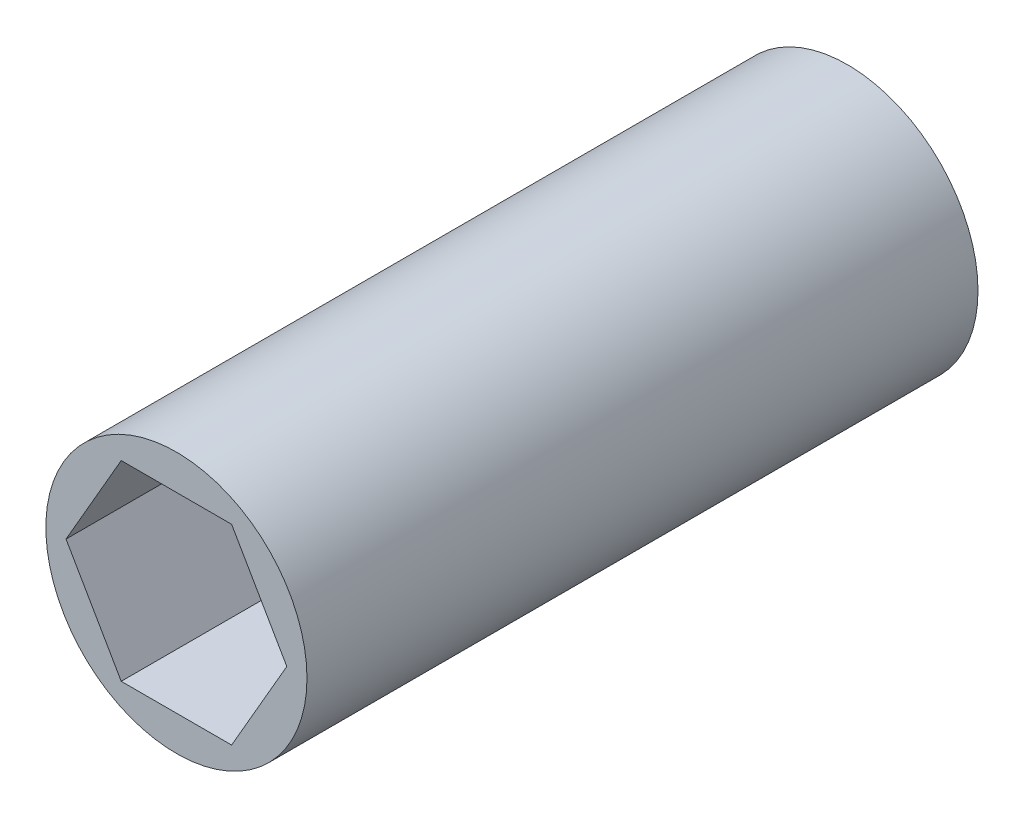
ISO-10303-21;
HEADER;
FILE_DESCRIPTION(('STEP AP214'),'2;1');
FILE_NAME('part.step','',(''),(''),'','','');
FILE_SCHEMA(('AUTOMOTIVE_DESIGN { 1 0 10303 214 1 1 1 1 }'));
ENDSEC;
DATA;
#1=APPLICATION_CONTEXT('core data for automotive mechanical design processes');
#2=APPLICATION_PROTOCOL_DEFINITION('international standard','automotive_design',2000,#1);
#3=PRODUCT_CONTEXT('',#1,'mechanical');
#4=PRODUCT('Part','Part','',(#3));
#5=PRODUCT_RELATED_PRODUCT_CATEGORY('part','',(#4));
#6=PRODUCT_DEFINITION_FORMATION('','',#4);
#7=PRODUCT_DEFINITION_CONTEXT('part definition',#1,'design');
#8=PRODUCT_DEFINITION('design','',#6,#7);
#9=PRODUCT_DEFINITION_SHAPE('','',#8);
#10=(LENGTH_UNIT() NAMED_UNIT(*) SI_UNIT(.MILLI.,.METRE.));
#11=(NAMED_UNIT(*) PLANE_ANGLE_UNIT() SI_UNIT($,.RADIAN.));
#12=(NAMED_UNIT(*) SI_UNIT($,.STERADIAN.) SOLID_ANGLE_UNIT());
#13=UNCERTAINTY_MEASURE_WITH_UNIT(LENGTH_MEASURE(1.E-05),#10,'distance_accuracy_value','');
#14=(GEOMETRIC_REPRESENTATION_CONTEXT(3) GLOBAL_UNCERTAINTY_ASSIGNED_CONTEXT((#13)) GLOBAL_UNIT_ASSIGNED_CONTEXT((#10,
#11,#12)) REPRESENTATION_CONTEXT('',''));
#15=CARTESIAN_POINT('',(0.,0.,0.));
#16=DIRECTION('',(0.,0.,1.));
#17=DIRECTION('',(1.,0.,0.));
#18=AXIS2_PLACEMENT_3D('',#15,#16,#17);
#19=CARTESIAN_POINT('',(0.,0.,-317.099786577786));
#20=DIRECTION('',(0.,0.,-1.));
#21=DIRECTION('',(0.,-1.,0.));
#22=AXIS2_PLACEMENT_3D('',#19,#20,#21);
#23=PLANE('',#22);
#24=DIRECTION('',(0.5,0.866025403784439,0.));
#25=VECTOR('',#24,1.);
#26=CARTESIAN_POINT('',(11.8356805183873,-20.5,-317.099786577786));
#27=LINE('',#26,#25);
#28=CARTESIAN_POINT('',(11.8356805183873,-20.5,-317.099786577786));
#29=VERTEX_POINT('',#28);
#30=CARTESIAN_POINT('',(23.6713610367747,0.,-317.099786577786));
#31=VERTEX_POINT('',#30);
#32=EDGE_CURVE('E154',#29,#31,#27,.T.);
#33=ORIENTED_EDGE('',*,*,#32,.F.);
#34=DIRECTION('',(1.,0.,0.));
#35=VECTOR('',#34,1.);
#36=CARTESIAN_POINT('',(-11.8356805183873,-20.5,-317.099786577786));
#37=LINE('',#36,#35);
#38=CARTESIAN_POINT('',(-11.8356805183873,-20.5,-317.099786577786));
#39=VERTEX_POINT('',#38);
#40=EDGE_CURVE('E255',#39,#29,#37,.T.);
#41=ORIENTED_EDGE('',*,*,#40,.F.);
#42=DIRECTION('',(0.5,-0.866025403784438,0.));
#43=VECTOR('',#42,1.);
#44=CARTESIAN_POINT('',(-23.6713610367747,0.,-317.099786577786));
#45=LINE('',#44,#43);
#46=CARTESIAN_POINT('',(-23.6713610367747,0.,-317.099786577786));
#47=VERTEX_POINT('',#46);
#48=EDGE_CURVE('E119',#47,#39,#45,.T.);
#49=ORIENTED_EDGE('',*,*,#48,.F.);
#50=DIRECTION('',(-0.5,-0.866025403784439,0.));
#51=VECTOR('',#50,1.);
#52=CARTESIAN_POINT('',(-11.8356805183874,20.5,-317.099786577786));
#53=LINE('',#52,#51);
#54=CARTESIAN_POINT('',(-11.8356805183874,20.5,-317.099786577786));
#55=VERTEX_POINT('',#54);
#56=EDGE_CURVE('E111',#55,#47,#53,.T.);
#57=ORIENTED_EDGE('',*,*,#56,.F.);
#58=DIRECTION('',(-1.,0.,0.));
#59=VECTOR('',#58,1.);
#60=CARTESIAN_POINT('',(11.8356805183873,20.5,-317.099786577786));
#61=LINE('',#60,#59);
#62=CARTESIAN_POINT('',(11.8356805183873,20.5,-317.099786577786));
#63=VERTEX_POINT('',#62);
#64=EDGE_CURVE('E94',#63,#55,#61,.T.);
#65=ORIENTED_EDGE('',*,*,#64,.F.);
#66=DIRECTION('',(-0.5,0.866025403784439,0.));
#67=VECTOR('',#66,1.);
#68=CARTESIAN_POINT('',(23.6713610367747,0.,-317.099786577786));
#69=LINE('',#68,#67);
#70=EDGE_CURVE('E137',#31,#63,#69,.T.);
#71=ORIENTED_EDGE('',*,*,#70,.F.);
#72=EDGE_LOOP('',(#33,#41,#49,#57,#65,#71));
#73=FACE_BOUND('',#72,.T.);
#74=CARTESIAN_POINT('',(0.,0.,-317.099786577786));
#75=DIRECTION('',(0.,0.,-1.));
#76=DIRECTION('',(-1.,0.,0.));
#77=AXIS2_PLACEMENT_3D('',#74,#75,#76);
#78=CIRCLE('',#77,28.);
#79=CARTESIAN_POINT('',(28.,0.,-317.099786577786));
#80=VERTEX_POINT('',#79);
#81=EDGE_CURVE('E11',#80,#80,#78,.T.);
#82=ORIENTED_EDGE('',*,*,#81,.F.);
#83=EDGE_LOOP('',(#82));
#84=FACE_BOUND('',#83,.T.);
#85=ADVANCED_FACE('F17',(#73,#84),#23,.F.);
#86=CARTESIAN_POINT('',(0.,0.,-461.));
#87=DIRECTION('',(0.,0.,-1.));
#88=DIRECTION('',(0.,-1.,0.));
#89=AXIS2_PLACEMENT_3D('',#86,#87,#88);
#90=PLANE('',#89);
#91=DIRECTION('',(0.5,0.866025403784439,0.));
#92=VECTOR('',#91,1.);
#93=CARTESIAN_POINT('',(11.8356805183873,-20.5,-461.));
#94=LINE('',#93,#92);
#95=CARTESIAN_POINT('',(11.8356805183873,-20.5,-461.));
#96=VERTEX_POINT('',#95);
#97=CARTESIAN_POINT('',(23.6713610367747,0.,-461.));
#98=VERTEX_POINT('',#97);
#99=EDGE_CURVE('E157',#96,#98,#94,.T.);
#100=ORIENTED_EDGE('',*,*,#99,.T.);
#101=DIRECTION('',(-0.5,0.866025403784439,0.));
#102=VECTOR('',#101,1.);
#103=CARTESIAN_POINT('',(23.6713610367747,0.,-461.));
#104=LINE('',#103,#102);
#105=CARTESIAN_POINT('',(11.8356805183873,20.5,-461.));
#106=VERTEX_POINT('',#105);
#107=EDGE_CURVE('E140',#98,#106,#104,.T.);
#108=ORIENTED_EDGE('',*,*,#107,.T.);
#109=DIRECTION('',(-1.,0.,0.));
#110=VECTOR('',#109,1.);
#111=CARTESIAN_POINT('',(11.8356805183873,20.5,-461.));
#112=LINE('',#111,#110);
#113=CARTESIAN_POINT('',(-11.8356805183874,20.5,-461.));
#114=VERTEX_POINT('',#113);
#115=EDGE_CURVE('E106',#106,#114,#112,.T.);
#116=ORIENTED_EDGE('',*,*,#115,.T.);
#117=DIRECTION('',(-0.5,-0.866025403784439,0.));
#118=VECTOR('',#117,1.);
#119=CARTESIAN_POINT('',(-11.8356805183874,20.5,-461.));
#120=LINE('',#119,#118);
#121=CARTESIAN_POINT('',(-23.6713610367747,0.,-461.));
#122=VERTEX_POINT('',#121);
#123=EDGE_CURVE('E113',#114,#122,#120,.T.);
#124=ORIENTED_EDGE('',*,*,#123,.T.);
#125=DIRECTION('',(0.5,-0.866025403784438,0.));
#126=VECTOR('',#125,1.);
#127=CARTESIAN_POINT('',(-23.6713610367747,0.,-461.));
#128=LINE('',#127,#126);
#129=CARTESIAN_POINT('',(-11.8356805183873,-20.5,-461.));
#130=VERTEX_POINT('',#129);
#131=EDGE_CURVE('E128',#122,#130,#128,.T.);
#132=ORIENTED_EDGE('',*,*,#131,.T.);
#133=DIRECTION('',(1.,0.,0.));
#134=VECTOR('',#133,1.);
#135=CARTESIAN_POINT('',(-11.8356805183873,-20.5,-461.));
#136=LINE('',#135,#134);
#137=EDGE_CURVE('E132',#130,#96,#136,.T.);
#138=ORIENTED_EDGE('',*,*,#137,.T.);
#139=EDGE_LOOP('',(#100,#108,#116,#124,#132,#138));
#140=FACE_BOUND('',#139,.T.);
#141=CARTESIAN_POINT('',(0.,0.,-461.));
#142=DIRECTION('',(0.,0.,-1.));
#143=DIRECTION('',(-1.,0.,0.));
#144=AXIS2_PLACEMENT_3D('',#141,#142,#143);
#145=CIRCLE('',#144,28.);
#146=CARTESIAN_POINT('',(28.,0.,-461.));
#147=VERTEX_POINT('',#146);
#148=EDGE_CURVE('E159',#147,#147,#145,.T.);
#149=ORIENTED_EDGE('',*,*,#148,.T.);
#150=EDGE_LOOP('',(#149));
#151=FACE_BOUND('',#150,.T.);
#152=ADVANCED_FACE('F169',(#140,#151),#90,.T.);
#153=CARTESIAN_POINT('',(0.,0.,-290.));
#154=DIRECTION('',(0.,0.,-1.));
#155=DIRECTION('',(-1.,0.,0.));
#156=AXIS2_PLACEMENT_3D('',#153,#154,#155);
#157=CYLINDRICAL_SURFACE('',#156,28.);
#158=ORIENTED_EDGE('',*,*,#148,.F.);
#159=DIRECTION('',(0.,0.,1.));
#160=VECTOR('',#159,1.);
#161=CARTESIAN_POINT('',(28.,0.,-290.));
#162=LINE('',#161,#160);
#163=EDGE_CURVE('E20',#147,#80,#162,.T.);
#164=ORIENTED_EDGE('',*,*,#163,.T.);
#165=ORIENTED_EDGE('',*,*,#81,.T.);
#166=ORIENTED_EDGE('',*,*,#163,.F.);
#167=EDGE_LOOP('',(#158,#164,#165,#166));
#168=FACE_BOUND('',#167,.T.);
#169=ADVANCED_FACE('F166',(#168),#157,.T.);
#170=CARTESIAN_POINT('',(11.8356805183873,-20.5,-290.));
#171=DIRECTION('',(-0.866025403784439,0.5,0.));
#172=DIRECTION('',(0.,0.,1.));
#173=AXIS2_PLACEMENT_3D('',#170,#171,#172);
#174=PLANE('',#173);
#175=ORIENTED_EDGE('',*,*,#32,.T.);
#176=DIRECTION('',(0.,0.,-1.));
#177=VECTOR('',#176,1.);
#178=CARTESIAN_POINT('',(23.6713610367747,0.,-290.));
#179=LINE('',#178,#177);
#180=EDGE_CURVE('E150',#31,#98,#179,.T.);
#181=ORIENTED_EDGE('',*,*,#180,.T.);
#182=ORIENTED_EDGE('',*,*,#99,.F.);
#183=DIRECTION('',(0.,0.,-1.));
#184=VECTOR('',#183,1.);
#185=CARTESIAN_POINT('',(11.8356805183873,-20.5,-290.));
#186=LINE('',#185,#184);
#187=EDGE_CURVE('E136',#29,#96,#186,.T.);
#188=ORIENTED_EDGE('',*,*,#187,.F.);
#189=EDGE_LOOP('',(#175,#181,#182,#188));
#190=FACE_BOUND('',#189,.T.);
#191=ADVANCED_FACE('F168',(#190),#174,.T.);
#192=CARTESIAN_POINT('',(23.6713610367747,0.,-290.));
#193=DIRECTION('',(-0.866025403784439,-0.5,0.));
#194=DIRECTION('',(-0.5,0.866025403784439,0.));
#195=AXIS2_PLACEMENT_3D('',#192,#193,#194);
#196=PLANE('',#195);
#197=ORIENTED_EDGE('',*,*,#70,.T.);
#198=DIRECTION('',(0.,0.,-1.));
#199=VECTOR('',#198,1.);
#200=CARTESIAN_POINT('',(11.8356805183873,20.5,-290.));
#201=LINE('',#200,#199);
#202=EDGE_CURVE('E101',#63,#106,#201,.T.);
#203=ORIENTED_EDGE('',*,*,#202,.T.);
#204=ORIENTED_EDGE('',*,*,#107,.F.);
#205=ORIENTED_EDGE('',*,*,#180,.F.);
#206=EDGE_LOOP('',(#197,#203,#204,#205));
#207=FACE_BOUND('',#206,.T.);
#208=ADVANCED_FACE('F176',(#207),#196,.T.);
#209=CARTESIAN_POINT('',(11.8356805183873,20.5,-290.));
#210=DIRECTION('',(0.,-1.,0.));
#211=DIRECTION('',(0.,0.,-1.));
#212=AXIS2_PLACEMENT_3D('',#209,#210,#211);
#213=PLANE('',#212);
#214=ORIENTED_EDGE('',*,*,#64,.T.);
#215=DIRECTION('',(0.,0.,-1.));
#216=VECTOR('',#215,1.);
#217=CARTESIAN_POINT('',(-11.8356805183874,20.5,-290.));
#218=LINE('',#217,#216);
#219=EDGE_CURVE('E98',#55,#114,#218,.T.);
#220=ORIENTED_EDGE('',*,*,#219,.T.);
#221=ORIENTED_EDGE('',*,*,#115,.F.);
#222=ORIENTED_EDGE('',*,*,#202,.F.);
#223=EDGE_LOOP('',(#214,#220,#221,#222));
#224=FACE_BOUND('',#223,.T.);
#225=ADVANCED_FACE('F96',(#224),#213,.T.);
#226=CARTESIAN_POINT('',(-11.8356805183874,20.5,-290.));
#227=DIRECTION('',(0.866025403784439,-0.5,0.));
#228=DIRECTION('',(0.,0.,-1.));
#229=AXIS2_PLACEMENT_3D('',#226,#227,#228);
#230=PLANE('',#229);
#231=ORIENTED_EDGE('',*,*,#56,.T.);
#232=DIRECTION('',(0.,0.,-1.));
#233=VECTOR('',#232,1.);
#234=CARTESIAN_POINT('',(-23.6713610367747,0.,-290.));
#235=LINE('',#234,#233);
#236=EDGE_CURVE('E121',#47,#122,#235,.T.);
#237=ORIENTED_EDGE('',*,*,#236,.T.);
#238=ORIENTED_EDGE('',*,*,#123,.F.);
#239=ORIENTED_EDGE('',*,*,#219,.F.);
#240=EDGE_LOOP('',(#231,#237,#238,#239));
#241=FACE_BOUND('',#240,.T.);
#242=ADVANCED_FACE('F109',(#241),#230,.T.);
#243=CARTESIAN_POINT('',(-23.6713610367747,0.,-290.));
#244=DIRECTION('',(0.866025403784438,0.5,0.));
#245=DIRECTION('',(0.,0.,-1.));
#246=AXIS2_PLACEMENT_3D('',#243,#244,#245);
#247=PLANE('',#246);
#248=ORIENTED_EDGE('',*,*,#48,.T.);
#249=DIRECTION('',(0.,0.,-1.));
#250=VECTOR('',#249,1.);
#251=CARTESIAN_POINT('',(-11.8356805183873,-20.5,-290.));
#252=LINE('',#251,#250);
#253=EDGE_CURVE('E135',#39,#130,#252,.T.);
#254=ORIENTED_EDGE('',*,*,#253,.T.);
#255=ORIENTED_EDGE('',*,*,#131,.F.);
#256=ORIENTED_EDGE('',*,*,#236,.F.);
#257=EDGE_LOOP('',(#248,#254,#255,#256));
#258=FACE_BOUND('',#257,.T.);
#259=ADVANCED_FACE('F230',(#258),#247,.T.);
#260=CARTESIAN_POINT('',(-11.8356805183873,-20.5,-290.));
#261=DIRECTION('',(0.,1.,0.));
#262=DIRECTION('',(1.,0.,0.));
#263=AXIS2_PLACEMENT_3D('',#260,#261,#262);
#264=PLANE('',#263);
#265=ORIENTED_EDGE('',*,*,#40,.T.);
#266=ORIENTED_EDGE('',*,*,#187,.T.);
#267=ORIENTED_EDGE('',*,*,#137,.F.);
#268=ORIENTED_EDGE('',*,*,#253,.F.);
#269=EDGE_LOOP('',(#265,#266,#267,#268));
#270=FACE_BOUND('',#269,.T.);
#271=ADVANCED_FACE('F238',(#270),#264,.T.);
#272=CLOSED_SHELL('',(#85,#152,#169,#191,#208,#225,#242,#259,#271));
#273=MANIFOLD_SOLID_BREP('B1',#272);
#274=ADVANCED_BREP_SHAPE_REPRESENTATION('',(#18,#273),#14);
#275=SHAPE_DEFINITION_REPRESENTATION(#9,#274);
ENDSEC;
END-ISO-10303-21;
